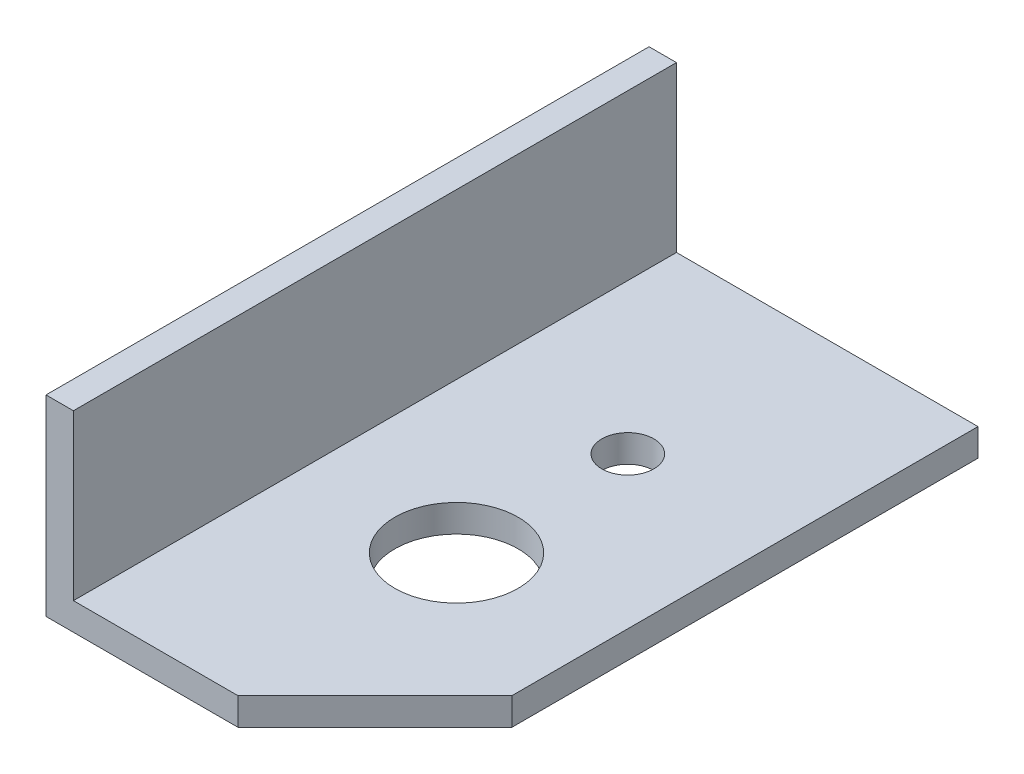
ISO-10303-21;
HEADER;
FILE_DESCRIPTION(('STEP AP214'),'2;1');
FILE_NAME('part.step','',(''),(''),'','','');
FILE_SCHEMA(('AUTOMOTIVE_DESIGN { 1 0 10303 214 1 1 1 1 }'));
ENDSEC;
DATA;
#1=APPLICATION_CONTEXT('core data for automotive mechanical design processes');
#2=APPLICATION_PROTOCOL_DEFINITION('international standard','automotive_design',2000,#1);
#3=PRODUCT_CONTEXT('',#1,'mechanical');
#4=PRODUCT('Part','Part','',(#3));
#5=PRODUCT_RELATED_PRODUCT_CATEGORY('part','',(#4));
#6=PRODUCT_DEFINITION_FORMATION('','',#4);
#7=PRODUCT_DEFINITION_CONTEXT('part definition',#1,'design');
#8=PRODUCT_DEFINITION('design','',#6,#7);
#9=PRODUCT_DEFINITION_SHAPE('','',#8);
#10=(LENGTH_UNIT() NAMED_UNIT(*) SI_UNIT(.MILLI.,.METRE.));
#11=(NAMED_UNIT(*) PLANE_ANGLE_UNIT() SI_UNIT($,.RADIAN.));
#12=(NAMED_UNIT(*) SI_UNIT($,.STERADIAN.) SOLID_ANGLE_UNIT());
#13=UNCERTAINTY_MEASURE_WITH_UNIT(LENGTH_MEASURE(1.E-05),#10,'distance_accuracy_value','');
#14=(GEOMETRIC_REPRESENTATION_CONTEXT(3) GLOBAL_UNCERTAINTY_ASSIGNED_CONTEXT((#13)) GLOBAL_UNIT_ASSIGNED_CONTEXT((#10,
#11,#12)) REPRESENTATION_CONTEXT('',''));
#15=CARTESIAN_POINT('',(0.,0.,0.));
#16=DIRECTION('',(0.,0.,1.));
#17=DIRECTION('',(1.,0.,0.));
#18=AXIS2_PLACEMENT_3D('',#15,#16,#17);
#19=CARTESIAN_POINT('',(0.,0.,44.));
#20=DIRECTION('',(0.,1.,0.));
#21=DIRECTION('',(0.,0.,1.));
#22=AXIS2_PLACEMENT_3D('',#19,#20,#21);
#23=PLANE('',#22);
#24=CARTESIAN_POINT('',(12.9500000000016,0.,26.9999999999998));
#25=DIRECTION('',(0.,1.,0.));
#26=DIRECTION('',(0.,0.,1.));
#27=AXIS2_PLACEMENT_3D('',#24,#25,#26);
#28=CIRCLE('',#27,4.5000000000011);
#29=CARTESIAN_POINT('',(12.9500000000016,0.,31.5000000000009));
#30=VERTEX_POINT('',#29);
#31=EDGE_CURVE('E165',#30,#30,#28,.T.);
#32=ORIENTED_EDGE('',*,*,#31,.T.);
#33=EDGE_LOOP('',(#32));
#34=FACE_BOUND('',#33,.T.);
#35=CARTESIAN_POINT('',(12.9500000000015,0.,14.5));
#36=DIRECTION('',(0.,1.,0.));
#37=DIRECTION('',(0.,0.,1.));
#38=AXIS2_PLACEMENT_3D('',#35,#36,#37);
#39=CIRCLE('',#38,1.90000000000095);
#40=CARTESIAN_POINT('',(12.9500000000015,0.,16.400000000001));
#41=VERTEX_POINT('',#40);
#42=EDGE_CURVE('E122',#41,#41,#39,.T.);
#43=ORIENTED_EDGE('',*,*,#42,.T.);
#44=EDGE_LOOP('',(#43));
#45=FACE_BOUND('',#44,.T.);
#46=DIRECTION('',(0.,0.,-1.));
#47=VECTOR('',#46,1.);
#48=CARTESIAN_POINT('',(24.,0.,44.));
#49=LINE('',#48,#47);
#50=CARTESIAN_POINT('',(24.,0.,34.));
#51=VERTEX_POINT('',#50);
#52=CARTESIAN_POINT('',(24.,0.,0.));
#53=VERTEX_POINT('',#52);
#54=EDGE_CURVE('E139',#51,#53,#49,.T.);
#55=ORIENTED_EDGE('',*,*,#54,.F.);
#56=DIRECTION('',(-0.707106781186549,0.,0.707106781186546));
#57=VECTOR('',#56,1.);
#58=CARTESIAN_POINT('',(24.,0.,34.));
#59=LINE('',#58,#57);
#60=CARTESIAN_POINT('',(14.,0.,44.));
#61=VERTEX_POINT('',#60);
#62=EDGE_CURVE('E53',#51,#61,#59,.T.);
#63=ORIENTED_EDGE('',*,*,#62,.T.);
#64=DIRECTION('',(1.,0.,0.));
#65=VECTOR('',#64,1.);
#66=CARTESIAN_POINT('',(0.,0.,44.));
#67=LINE('',#66,#65);
#68=CARTESIAN_POINT('',(0.,0.,44.));
#69=VERTEX_POINT('',#68);
#70=EDGE_CURVE('E107',#69,#61,#67,.T.);
#71=ORIENTED_EDGE('',*,*,#70,.F.);
#72=DIRECTION('',(0.,0.,-1.));
#73=VECTOR('',#72,1.);
#74=CARTESIAN_POINT('',(0.,0.,44.));
#75=LINE('',#74,#73);
#76=CARTESIAN_POINT('',(0.,0.,0.));
#77=VERTEX_POINT('',#76);
#78=EDGE_CURVE('E117',#69,#77,#75,.T.);
#79=ORIENTED_EDGE('',*,*,#78,.T.);
#80=DIRECTION('',(1.,0.,0.));
#81=VECTOR('',#80,1.);
#82=CARTESIAN_POINT('',(0.,0.,0.));
#83=LINE('',#82,#81);
#84=EDGE_CURVE('E118',#77,#53,#83,.T.);
#85=ORIENTED_EDGE('',*,*,#84,.T.);
#86=EDGE_LOOP('',(#55,#63,#71,#79,#85));
#87=FACE_BOUND('',#86,.T.);
#88=ADVANCED_FACE('F31',(#34,#45,#87),#23,.F.);
#89=CARTESIAN_POINT('',(24.,2.,44.));
#90=DIRECTION('',(1.,0.,0.));
#91=DIRECTION('',(0.,0.,-1.));
#92=AXIS2_PLACEMENT_3D('',#89,#90,#91);
#93=PLANE('',#92);
#94=DIRECTION('',(0.,0.,-1.));
#95=VECTOR('',#94,1.);
#96=CARTESIAN_POINT('',(24.,2.,44.));
#97=LINE('',#96,#95);
#98=CARTESIAN_POINT('',(24.,2.,34.));
#99=VERTEX_POINT('',#98);
#100=CARTESIAN_POINT('',(24.,2.,0.));
#101=VERTEX_POINT('',#100);
#102=EDGE_CURVE('E99',#99,#101,#97,.T.);
#103=ORIENTED_EDGE('',*,*,#102,.F.);
#104=DIRECTION('',(0.,-1.,0.));
#105=VECTOR('',#104,1.);
#106=CARTESIAN_POINT('',(24.,0.,34.));
#107=LINE('',#106,#105);
#108=EDGE_CURVE('E141',#99,#51,#107,.T.);
#109=ORIENTED_EDGE('',*,*,#108,.T.);
#110=ORIENTED_EDGE('',*,*,#54,.T.);
#111=DIRECTION('',(0.,-1.,0.));
#112=VECTOR('',#111,1.);
#113=CARTESIAN_POINT('',(24.,2.,0.));
#114=LINE('',#113,#112);
#115=EDGE_CURVE('E121',#101,#53,#114,.T.);
#116=ORIENTED_EDGE('',*,*,#115,.F.);
#117=EDGE_LOOP('',(#103,#109,#110,#116));
#118=FACE_BOUND('',#117,.T.);
#119=ADVANCED_FACE('F147',(#118),#93,.T.);
#120=CARTESIAN_POINT('',(0.,2.,44.));
#121=DIRECTION('',(0.,1.,0.));
#122=DIRECTION('',(0.,0.,1.));
#123=AXIS2_PLACEMENT_3D('',#120,#121,#122);
#124=PLANE('',#123);
#125=CARTESIAN_POINT('',(12.9500000000016,2.,26.9999999999998));
#126=DIRECTION('',(0.,1.,0.));
#127=DIRECTION('',(0.,0.,1.));
#128=AXIS2_PLACEMENT_3D('',#125,#126,#127);
#129=CIRCLE('',#128,4.5000000000011);
#130=CARTESIAN_POINT('',(12.9500000000016,2.,31.5000000000009));
#131=VERTEX_POINT('',#130);
#132=EDGE_CURVE('E168',#131,#131,#129,.T.);
#133=ORIENTED_EDGE('',*,*,#132,.F.);
#134=EDGE_LOOP('',(#133));
#135=FACE_BOUND('',#134,.T.);
#136=CARTESIAN_POINT('',(12.9500000000015,2.,14.5));
#137=DIRECTION('',(0.,1.,0.));
#138=DIRECTION('',(0.,0.,1.));
#139=AXIS2_PLACEMENT_3D('',#136,#137,#138);
#140=CIRCLE('',#139,1.90000000000095);
#141=CARTESIAN_POINT('',(12.9500000000015,2.,16.400000000001));
#142=VERTEX_POINT('',#141);
#143=EDGE_CURVE('E162',#142,#142,#140,.T.);
#144=ORIENTED_EDGE('',*,*,#143,.F.);
#145=EDGE_LOOP('',(#144));
#146=FACE_BOUND('',#145,.T.);
#147=DIRECTION('',(1.,0.,0.));
#148=VECTOR('',#147,1.);
#149=CARTESIAN_POINT('',(0.,2.,44.));
#150=LINE('',#149,#148);
#151=CARTESIAN_POINT('',(2.,2.,44.));
#152=VERTEX_POINT('',#151);
#153=CARTESIAN_POINT('',(14.,2.,44.));
#154=VERTEX_POINT('',#153);
#155=EDGE_CURVE('E91',#152,#154,#150,.T.);
#156=ORIENTED_EDGE('',*,*,#155,.T.);
#157=DIRECTION('',(0.707106781186549,0.,-0.707106781186546));
#158=VECTOR('',#157,1.);
#159=CARTESIAN_POINT('',(6.99999999999995,2.,51.));
#160=LINE('',#159,#158);
#161=EDGE_CURVE('E11',#154,#99,#160,.T.);
#162=ORIENTED_EDGE('',*,*,#161,.T.);
#163=ORIENTED_EDGE('',*,*,#102,.T.);
#164=DIRECTION('',(1.,0.,0.));
#165=VECTOR('',#164,1.);
#166=CARTESIAN_POINT('',(0.,2.,0.));
#167=LINE('',#166,#165);
#168=CARTESIAN_POINT('',(2.,2.,0.));
#169=VERTEX_POINT('',#168);
#170=EDGE_CURVE('E94',#169,#101,#167,.T.);
#171=ORIENTED_EDGE('',*,*,#170,.F.);
#172=DIRECTION('',(0.,0.,-1.));
#173=VECTOR('',#172,1.);
#174=CARTESIAN_POINT('',(2.,2.,44.));
#175=LINE('',#174,#173);
#176=EDGE_CURVE('E89',#152,#169,#175,.T.);
#177=ORIENTED_EDGE('',*,*,#176,.F.);
#178=EDGE_LOOP('',(#156,#162,#163,#171,#177));
#179=FACE_BOUND('',#178,.T.);
#180=ADVANCED_FACE('F90',(#135,#146,#179),#124,.T.);
#181=CARTESIAN_POINT('',(2.,0.,44.));
#182=DIRECTION('',(1.,0.,0.));
#183=DIRECTION('',(0.,0.,-1.));
#184=AXIS2_PLACEMENT_3D('',#181,#182,#183);
#185=PLANE('',#184);
#186=DIRECTION('',(0.,1.,0.));
#187=VECTOR('',#186,1.);
#188=CARTESIAN_POINT('',(2.,0.,0.));
#189=LINE('',#188,#187);
#190=CARTESIAN_POINT('',(2.,14.,0.));
#191=VERTEX_POINT('',#190);
#192=EDGE_CURVE('E126',#191,#169,#189,.F.);
#193=ORIENTED_EDGE('',*,*,#192,.F.);
#194=DIRECTION('',(0.,0.,-1.));
#195=VECTOR('',#194,1.);
#196=CARTESIAN_POINT('',(2.,14.,44.));
#197=LINE('',#196,#195);
#198=CARTESIAN_POINT('',(2.,14.,44.));
#199=VERTEX_POINT('',#198);
#200=EDGE_CURVE('E100',#199,#191,#197,.T.);
#201=ORIENTED_EDGE('',*,*,#200,.F.);
#202=DIRECTION('',(0.,1.,0.));
#203=VECTOR('',#202,1.);
#204=CARTESIAN_POINT('',(2.,0.,44.));
#205=LINE('',#204,#203);
#206=EDGE_CURVE('E105',#199,#152,#205,.F.);
#207=ORIENTED_EDGE('',*,*,#206,.T.);
#208=ORIENTED_EDGE('',*,*,#176,.T.);
#209=EDGE_LOOP('',(#193,#201,#207,#208));
#210=FACE_BOUND('',#209,.T.);
#211=ADVANCED_FACE('F109',(#210),#185,.T.);
#212=CARTESIAN_POINT('',(0.,14.,44.));
#213=DIRECTION('',(0.,1.,0.));
#214=DIRECTION('',(0.,0.,1.));
#215=AXIS2_PLACEMENT_3D('',#212,#213,#214);
#216=PLANE('',#215);
#217=DIRECTION('',(1.,0.,0.));
#218=VECTOR('',#217,1.);
#219=CARTESIAN_POINT('',(0.,14.,0.));
#220=LINE('',#219,#218);
#221=CARTESIAN_POINT('',(0.,14.,0.));
#222=VERTEX_POINT('',#221);
#223=EDGE_CURVE('E128',#222,#191,#220,.T.);
#224=ORIENTED_EDGE('',*,*,#223,.F.);
#225=DIRECTION('',(0.,0.,-1.));
#226=VECTOR('',#225,1.);
#227=CARTESIAN_POINT('',(0.,14.,44.));
#228=LINE('',#227,#226);
#229=CARTESIAN_POINT('',(0.,14.,44.));
#230=VERTEX_POINT('',#229);
#231=EDGE_CURVE('E135',#230,#222,#228,.T.);
#232=ORIENTED_EDGE('',*,*,#231,.F.);
#233=DIRECTION('',(1.,0.,0.));
#234=VECTOR('',#233,1.);
#235=CARTESIAN_POINT('',(0.,14.,44.));
#236=LINE('',#235,#234);
#237=EDGE_CURVE('E110',#230,#199,#236,.T.);
#238=ORIENTED_EDGE('',*,*,#237,.T.);
#239=ORIENTED_EDGE('',*,*,#200,.T.);
#240=EDGE_LOOP('',(#224,#232,#238,#239));
#241=FACE_BOUND('',#240,.T.);
#242=ADVANCED_FACE('F157',(#241),#216,.T.);
#243=CARTESIAN_POINT('',(0.,0.,44.));
#244=DIRECTION('',(1.,0.,0.));
#245=DIRECTION('',(0.,0.,-1.));
#246=AXIS2_PLACEMENT_3D('',#243,#244,#245);
#247=PLANE('',#246);
#248=DIRECTION('',(0.,-1.,0.));
#249=VECTOR('',#248,1.);
#250=CARTESIAN_POINT('',(0.,0.,0.));
#251=LINE('',#250,#249);
#252=EDGE_CURVE('E131',#222,#77,#251,.T.);
#253=ORIENTED_EDGE('',*,*,#252,.T.);
#254=ORIENTED_EDGE('',*,*,#78,.F.);
#255=DIRECTION('',(0.,-1.,0.));
#256=VECTOR('',#255,1.);
#257=CARTESIAN_POINT('',(0.,0.,44.));
#258=LINE('',#257,#256);
#259=EDGE_CURVE('E112',#230,#69,#258,.T.);
#260=ORIENTED_EDGE('',*,*,#259,.F.);
#261=ORIENTED_EDGE('',*,*,#231,.T.);
#262=EDGE_LOOP('',(#253,#254,#260,#261));
#263=FACE_BOUND('',#262,.T.);
#264=ADVANCED_FACE('F160',(#263),#247,.F.);
#265=CARTESIAN_POINT('',(24.,0.,44.));
#266=DIRECTION('',(0.,0.,-1.));
#267=DIRECTION('',(-1.,0.,0.));
#268=AXIS2_PLACEMENT_3D('',#265,#266,#267);
#269=PLANE('',#268);
#270=ORIENTED_EDGE('',*,*,#70,.T.);
#271=DIRECTION('',(0.,1.,0.));
#272=VECTOR('',#271,1.);
#273=CARTESIAN_POINT('',(14.,2.,44.));
#274=LINE('',#273,#272);
#275=EDGE_CURVE('E39',#61,#154,#274,.T.);
#276=ORIENTED_EDGE('',*,*,#275,.T.);
#277=ORIENTED_EDGE('',*,*,#155,.F.);
#278=ORIENTED_EDGE('',*,*,#206,.F.);
#279=ORIENTED_EDGE('',*,*,#237,.F.);
#280=ORIENTED_EDGE('',*,*,#259,.T.);
#281=EDGE_LOOP('',(#270,#276,#277,#278,#279,#280));
#282=FACE_BOUND('',#281,.T.);
#283=ADVANCED_FACE('F103',(#282),#269,.F.);
#284=CARTESIAN_POINT('',(24.,0.,0.));
#285=DIRECTION('',(0.,0.,-1.));
#286=DIRECTION('',(-1.,0.,0.));
#287=AXIS2_PLACEMENT_3D('',#284,#285,#286);
#288=PLANE('',#287);
#289=ORIENTED_EDGE('',*,*,#84,.F.);
#290=ORIENTED_EDGE('',*,*,#252,.F.);
#291=ORIENTED_EDGE('',*,*,#223,.T.);
#292=ORIENTED_EDGE('',*,*,#192,.T.);
#293=ORIENTED_EDGE('',*,*,#170,.T.);
#294=ORIENTED_EDGE('',*,*,#115,.T.);
#295=EDGE_LOOP('',(#289,#290,#291,#292,#293,#294));
#296=FACE_BOUND('',#295,.T.);
#297=ADVANCED_FACE('F154',(#296),#288,.T.);
#298=CARTESIAN_POINT('',(12.9500000000015,0.,14.5));
#299=DIRECTION('',(0.,1.,0.));
#300=DIRECTION('',(0.,0.,1.));
#301=AXIS2_PLACEMENT_3D('',#298,#299,#300);
#302=CYLINDRICAL_SURFACE('',#301,1.90000000000095);
#303=ORIENTED_EDGE('',*,*,#42,.F.);
#304=EDGE_LOOP('',(#303));
#305=FACE_BOUND('',#304,.T.);
#306=ORIENTED_EDGE('',*,*,#143,.T.);
#307=EDGE_LOOP('',(#306));
#308=FACE_BOUND('',#307,.T.);
#309=ADVANCED_FACE('F179',(#305,#308),#302,.F.);
#310=CARTESIAN_POINT('',(12.9500000000016,0.,26.9999999999998));
#311=DIRECTION('',(0.,1.,0.));
#312=DIRECTION('',(0.,0.,1.));
#313=AXIS2_PLACEMENT_3D('',#310,#311,#312);
#314=CYLINDRICAL_SURFACE('',#313,4.5000000000011);
#315=ORIENTED_EDGE('',*,*,#31,.F.);
#316=EDGE_LOOP('',(#315));
#317=FACE_BOUND('',#316,.T.);
#318=ORIENTED_EDGE('',*,*,#132,.T.);
#319=EDGE_LOOP('',(#318));
#320=FACE_BOUND('',#319,.T.);
#321=ADVANCED_FACE('F176',(#317,#320),#314,.F.);
#322=CARTESIAN_POINT('',(24.,2.,34.));
#323=DIRECTION('',(0.707106781186546,0.,0.707106781186549));
#324=DIRECTION('',(0.707106781186549,0.,-0.707106781186546));
#325=AXIS2_PLACEMENT_3D('',#322,#323,#324);
#326=PLANE('',#325);
#327=ORIENTED_EDGE('',*,*,#161,.F.);
#328=ORIENTED_EDGE('',*,*,#275,.F.);
#329=ORIENTED_EDGE('',*,*,#62,.F.);
#330=ORIENTED_EDGE('',*,*,#108,.F.);
#331=EDGE_LOOP('',(#327,#328,#329,#330));
#332=FACE_BOUND('',#331,.T.);
#333=ADVANCED_FACE('F33',(#332),#326,.T.);
#334=CLOSED_SHELL('',(#88,#119,#180,#211,#242,#264,#283,#297,#309,#321,#333));
#335=MANIFOLD_SOLID_BREP('B2',#334);
#336=ADVANCED_BREP_SHAPE_REPRESENTATION('',(#18,#335),#14);
#337=SHAPE_DEFINITION_REPRESENTATION(#9,#336);
ENDSEC;
END-ISO-10303-21;
